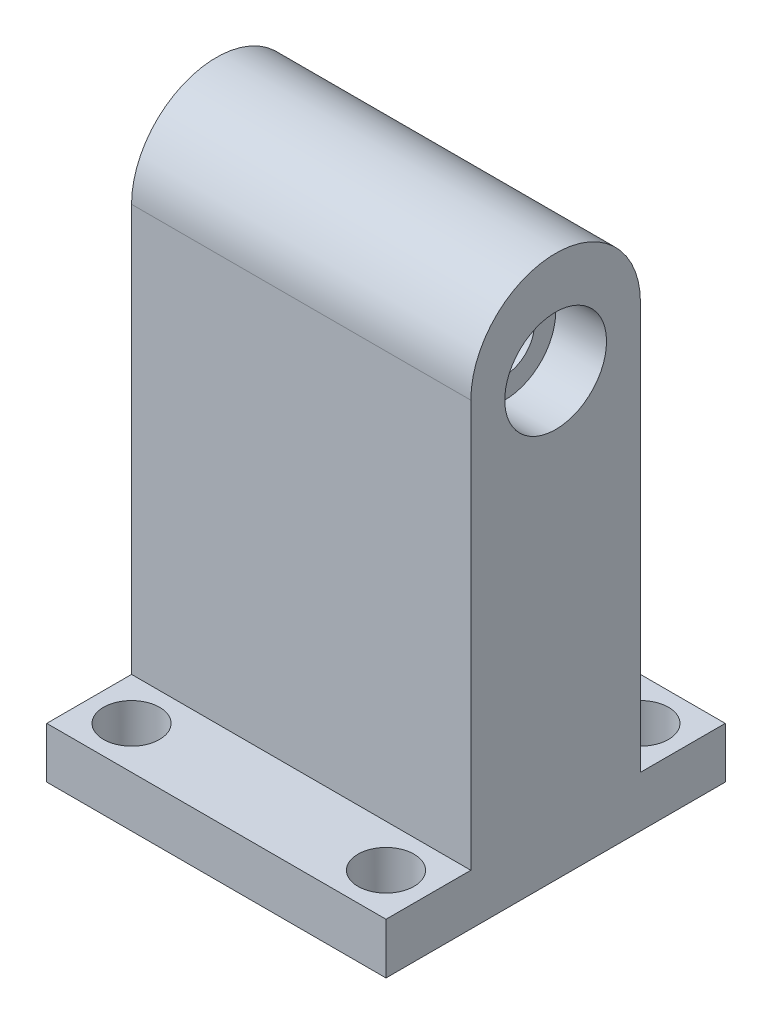
ISO-10303-21;
HEADER;
FILE_DESCRIPTION(('STEP AP214'),'2;1');
FILE_NAME('part.step','',(''),(''),'','','');
FILE_SCHEMA(('AUTOMOTIVE_DESIGN { 1 0 10303 214 1 1 1 1 }'));
ENDSEC;
DATA;
#1=APPLICATION_CONTEXT('core data for automotive mechanical design processes');
#2=APPLICATION_PROTOCOL_DEFINITION('international standard','automotive_design',2000,#1);
#3=PRODUCT_CONTEXT('',#1,'mechanical');
#4=PRODUCT('Part','Part','',(#3));
#5=PRODUCT_RELATED_PRODUCT_CATEGORY('part','',(#4));
#6=PRODUCT_DEFINITION_FORMATION('','',#4);
#7=PRODUCT_DEFINITION_CONTEXT('part definition',#1,'design');
#8=PRODUCT_DEFINITION('design','',#6,#7);
#9=PRODUCT_DEFINITION_SHAPE('','',#8);
#10=(LENGTH_UNIT() NAMED_UNIT(*) SI_UNIT(.MILLI.,.METRE.));
#11=(NAMED_UNIT(*) PLANE_ANGLE_UNIT() SI_UNIT($,.RADIAN.));
#12=(NAMED_UNIT(*) SI_UNIT($,.STERADIAN.) SOLID_ANGLE_UNIT());
#13=UNCERTAINTY_MEASURE_WITH_UNIT(LENGTH_MEASURE(1.E-05),#10,'distance_accuracy_value','');
#14=(GEOMETRIC_REPRESENTATION_CONTEXT(3) GLOBAL_UNCERTAINTY_ASSIGNED_CONTEXT((#13)) GLOBAL_UNIT_ASSIGNED_CONTEXT((#10,
#11,#12)) REPRESENTATION_CONTEXT('',''));
#15=CARTESIAN_POINT('',(0.,0.,0.));
#16=DIRECTION('',(0.,0.,1.));
#17=DIRECTION('',(1.,0.,0.));
#18=AXIS2_PLACEMENT_3D('',#15,#16,#17);
#19=CARTESIAN_POINT('',(-10.,26.,0.));
#20=DIRECTION('',(1.,0.,0.));
#21=DIRECTION('',(0.,0.,-1.));
#22=AXIS2_PLACEMENT_3D('',#19,#20,#21);
#23=CYLINDRICAL_SURFACE('',#22,1.75);
#24=CARTESIAN_POINT('',(7.,26.,0.));
#25=DIRECTION('',(1.,0.,0.));
#26=DIRECTION('',(0.,0.,-1.));
#27=AXIS2_PLACEMENT_3D('',#24,#25,#26);
#28=CIRCLE('',#27,1.75);
#29=CARTESIAN_POINT('',(7.,26.,-1.75));
#30=VERTEX_POINT('',#29);
#31=EDGE_CURVE('E167',#30,#30,#28,.T.);
#32=ORIENTED_EDGE('',*,*,#31,.T.);
#33=EDGE_LOOP('',(#32));
#34=FACE_BOUND('',#33,.T.);
#35=CARTESIAN_POINT('',(-7.,26.,0.));
#36=DIRECTION('',(-1.,0.,0.));
#37=DIRECTION('',(0.,0.,1.));
#38=AXIS2_PLACEMENT_3D('',#35,#36,#37);
#39=CIRCLE('',#38,1.75);
#40=CARTESIAN_POINT('',(-7.,26.,1.75));
#41=VERTEX_POINT('',#40);
#42=EDGE_CURVE('E164',#41,#41,#39,.F.);
#43=ORIENTED_EDGE('',*,*,#42,.F.);
#44=EDGE_LOOP('',(#43));
#45=FACE_BOUND('',#44,.T.);
#46=ADVANCED_FACE('F43',(#34,#45),#23,.F.);
#47=CARTESIAN_POINT('',(10.,36.,-9.99999999999999));
#48=DIRECTION('',(-1.,0.,0.));
#49=DIRECTION('',(0.,0.,1.));
#50=AXIS2_PLACEMENT_3D('',#47,#48,#49);
#51=PLANE('',#50);
#52=CARTESIAN_POINT('',(10.,26.,0.));
#53=DIRECTION('',(1.,0.,0.));
#54=DIRECTION('',(0.,0.,-1.));
#55=AXIS2_PLACEMENT_3D('',#52,#53,#54);
#56=CIRCLE('',#55,3.);
#57=CARTESIAN_POINT('',(10.,26.,-3.));
#58=VERTEX_POINT('',#57);
#59=EDGE_CURVE('E147',#58,#58,#56,.T.);
#60=ORIENTED_EDGE('',*,*,#59,.F.);
#61=EDGE_LOOP('',(#60));
#62=FACE_BOUND('',#61,.T.);
#63=DIRECTION('',(0.,-1.,0.));
#64=VECTOR('',#63,1.);
#65=CARTESIAN_POINT('',(10.,27.,5.));
#66=LINE('',#65,#64);
#67=CARTESIAN_POINT('',(10.,27.,5.));
#68=VERTEX_POINT('',#67);
#69=CARTESIAN_POINT('',(10.,3.,5.));
#70=VERTEX_POINT('',#69);
#71=EDGE_CURVE('E297',#68,#70,#66,.T.);
#72=ORIENTED_EDGE('',*,*,#71,.T.);
#73=DIRECTION('',(0.,0.,1.));
#74=VECTOR('',#73,1.);
#75=CARTESIAN_POINT('',(10.,3.,5.));
#76=LINE('',#75,#74);
#77=CARTESIAN_POINT('',(10.,3.,10.));
#78=VERTEX_POINT('',#77);
#79=EDGE_CURVE('E131',#70,#78,#76,.T.);
#80=ORIENTED_EDGE('',*,*,#79,.T.);
#81=DIRECTION('',(0.,-1.,0.));
#82=VECTOR('',#81,1.);
#83=CARTESIAN_POINT('',(10.,36.,10.));
#84=LINE('',#83,#82);
#85=CARTESIAN_POINT('',(10.,0.,10.));
#86=VERTEX_POINT('',#85);
#87=EDGE_CURVE('E69',#78,#86,#84,.T.);
#88=ORIENTED_EDGE('',*,*,#87,.T.);
#89=DIRECTION('',(0.,0.,-1.));
#90=VECTOR('',#89,1.);
#91=CARTESIAN_POINT('',(10.,0.,-9.99999999999999));
#92=LINE('',#91,#90);
#93=CARTESIAN_POINT('',(10.,0.,-9.99999999999999));
#94=VERTEX_POINT('',#93);
#95=EDGE_CURVE('E135',#86,#94,#92,.T.);
#96=ORIENTED_EDGE('',*,*,#95,.T.);
#97=DIRECTION('',(0.,-1.,0.));
#98=VECTOR('',#97,1.);
#99=CARTESIAN_POINT('',(10.,36.,-9.99999999999999));
#100=LINE('',#99,#98);
#101=CARTESIAN_POINT('',(10.,3.,-10.));
#102=VERTEX_POINT('',#101);
#103=EDGE_CURVE('E11',#102,#94,#100,.T.);
#104=ORIENTED_EDGE('',*,*,#103,.F.);
#105=DIRECTION('',(0.,0.,1.));
#106=VECTOR('',#105,1.);
#107=CARTESIAN_POINT('',(10.,3.,-10.));
#108=LINE('',#107,#106);
#109=CARTESIAN_POINT('',(10.,3.,-5.));
#110=VERTEX_POINT('',#109);
#111=EDGE_CURVE('E111',#102,#110,#108,.T.);
#112=ORIENTED_EDGE('',*,*,#111,.T.);
#113=DIRECTION('',(0.,1.,0.));
#114=VECTOR('',#113,1.);
#115=CARTESIAN_POINT('',(10.,3.,-5.));
#116=LINE('',#115,#114);
#117=CARTESIAN_POINT('',(10.,27.,-5.));
#118=VERTEX_POINT('',#117);
#119=EDGE_CURVE('E123',#110,#118,#116,.T.);
#120=ORIENTED_EDGE('',*,*,#119,.T.);
#121=CARTESIAN_POINT('',(10.,27.,0.));
#122=DIRECTION('',(1.,0.,0.));
#123=DIRECTION('',(0.,0.,-1.));
#124=AXIS2_PLACEMENT_3D('',#121,#122,#123);
#125=CIRCLE('',#124,5.);
#126=EDGE_CURVE('E293',#118,#68,#125,.T.);
#127=ORIENTED_EDGE('',*,*,#126,.T.);
#128=EDGE_LOOP('',(#72,#80,#88,#96,#104,#112,#120,#127));
#129=FACE_BOUND('',#128,.T.);
#130=ADVANCED_FACE('F45',(#62,#129),#51,.F.);
#131=CARTESIAN_POINT('',(-10.,36.,-9.99999999999999));
#132=DIRECTION('',(0.,0.,1.));
#133=DIRECTION('',(1.,0.,0.));
#134=AXIS2_PLACEMENT_3D('',#131,#132,#133);
#135=PLANE('',#134);
#136=DIRECTION('',(0.,-1.,0.));
#137=VECTOR('',#136,1.);
#138=CARTESIAN_POINT('',(-10.,36.,-9.99999999999999));
#139=LINE('',#138,#137);
#140=CARTESIAN_POINT('',(-10.,3.,-9.99999999999999));
#141=VERTEX_POINT('',#140);
#142=CARTESIAN_POINT('',(-10.,0.,-9.99999999999999));
#143=VERTEX_POINT('',#142);
#144=EDGE_CURVE('E53',#141,#143,#139,.T.);
#145=ORIENTED_EDGE('',*,*,#144,.F.);
#146=DIRECTION('',(-1.,0.,0.));
#147=VECTOR('',#146,1.);
#148=CARTESIAN_POINT('',(10.,3.,-10.));
#149=LINE('',#148,#147);
#150=EDGE_CURVE('E116',#102,#141,#149,.T.);
#151=ORIENTED_EDGE('',*,*,#150,.F.);
#152=ORIENTED_EDGE('',*,*,#103,.T.);
#153=DIRECTION('',(-1.,0.,0.));
#154=VECTOR('',#153,1.);
#155=CARTESIAN_POINT('',(-10.,0.,-9.99999999999999));
#156=LINE('',#155,#154);
#157=EDGE_CURVE('E139',#94,#143,#156,.T.);
#158=ORIENTED_EDGE('',*,*,#157,.T.);
#159=EDGE_LOOP('',(#145,#151,#152,#158));
#160=FACE_BOUND('',#159,.T.);
#161=ADVANCED_FACE('F127',(#160),#135,.F.);
#162=CARTESIAN_POINT('',(-10.,36.,-9.99999999999999));
#163=DIRECTION('',(1.,0.,0.));
#164=DIRECTION('',(0.,0.,-1.));
#165=AXIS2_PLACEMENT_3D('',#162,#163,#164);
#166=PLANE('',#165);
#167=CARTESIAN_POINT('',(-10.,26.,0.));
#168=DIRECTION('',(-1.,0.,0.));
#169=DIRECTION('',(0.,0.,1.));
#170=AXIS2_PLACEMENT_3D('',#167,#168,#169);
#171=CIRCLE('',#170,3.);
#172=CARTESIAN_POINT('',(-10.,26.,3.));
#173=VERTEX_POINT('',#172);
#174=EDGE_CURVE('E217',#173,#173,#171,.T.);
#175=ORIENTED_EDGE('',*,*,#174,.F.);
#176=EDGE_LOOP('',(#175));
#177=FACE_BOUND('',#176,.T.);
#178=DIRECTION('',(0.,-1.,0.));
#179=VECTOR('',#178,1.);
#180=CARTESIAN_POINT('',(-10.,36.,10.));
#181=LINE('',#180,#179);
#182=CARTESIAN_POINT('',(-10.,3.,10.));
#183=VERTEX_POINT('',#182);
#184=CARTESIAN_POINT('',(-10.,0.,10.));
#185=VERTEX_POINT('',#184);
#186=EDGE_CURVE('E159',#183,#185,#181,.T.);
#187=ORIENTED_EDGE('',*,*,#186,.F.);
#188=DIRECTION('',(0.,0.,1.));
#189=VECTOR('',#188,1.);
#190=CARTESIAN_POINT('',(-10.,3.,5.));
#191=LINE('',#190,#189);
#192=CARTESIAN_POINT('',(-10.,3.,5.));
#193=VERTEX_POINT('',#192);
#194=EDGE_CURVE('E61',#193,#183,#191,.T.);
#195=ORIENTED_EDGE('',*,*,#194,.F.);
#196=DIRECTION('',(0.,-1.,0.));
#197=VECTOR('',#196,1.);
#198=CARTESIAN_POINT('',(-10.,27.,5.));
#199=LINE('',#198,#197);
#200=CARTESIAN_POINT('',(-10.,27.,5.));
#201=VERTEX_POINT('',#200);
#202=EDGE_CURVE('E286',#201,#193,#199,.T.);
#203=ORIENTED_EDGE('',*,*,#202,.F.);
#204=CARTESIAN_POINT('',(-10.,27.,0.));
#205=DIRECTION('',(1.,0.,0.));
#206=DIRECTION('',(0.,0.,-1.));
#207=AXIS2_PLACEMENT_3D('',#204,#205,#206);
#208=CIRCLE('',#207,5.);
#209=CARTESIAN_POINT('',(-10.,27.,-5.));
#210=VERTEX_POINT('',#209);
#211=EDGE_CURVE('E279',#210,#201,#208,.T.);
#212=ORIENTED_EDGE('',*,*,#211,.F.);
#213=DIRECTION('',(0.,1.,0.));
#214=VECTOR('',#213,1.);
#215=CARTESIAN_POINT('',(-10.,3.,-5.));
#216=LINE('',#215,#214);
#217=CARTESIAN_POINT('',(-10.,3.,-5.));
#218=VERTEX_POINT('',#217);
#219=EDGE_CURVE('E275',#218,#210,#216,.T.);
#220=ORIENTED_EDGE('',*,*,#219,.F.);
#221=DIRECTION('',(0.,0.,1.));
#222=VECTOR('',#221,1.);
#223=CARTESIAN_POINT('',(-10.,3.,-9.99999999999999));
#224=LINE('',#223,#222);
#225=EDGE_CURVE('E272',#141,#218,#224,.T.);
#226=ORIENTED_EDGE('',*,*,#225,.F.);
#227=ORIENTED_EDGE('',*,*,#144,.T.);
#228=DIRECTION('',(0.,0.,1.));
#229=VECTOR('',#228,1.);
#230=CARTESIAN_POINT('',(-10.,0.,-9.99999999999999));
#231=LINE('',#230,#229);
#232=EDGE_CURVE('E144',#143,#185,#231,.T.);
#233=ORIENTED_EDGE('',*,*,#232,.T.);
#234=EDGE_LOOP('',(#187,#195,#203,#212,#220,#226,#227,#233));
#235=FACE_BOUND('',#234,.T.);
#236=ADVANCED_FACE('F239',(#177,#235),#166,.F.);
#237=CARTESIAN_POINT('',(-10.,36.,10.));
#238=DIRECTION('',(0.,0.,-1.));
#239=DIRECTION('',(-1.,0.,0.));
#240=AXIS2_PLACEMENT_3D('',#237,#238,#239);
#241=PLANE('',#240);
#242=ORIENTED_EDGE('',*,*,#87,.F.);
#243=DIRECTION('',(-1.,0.,0.));
#244=VECTOR('',#243,1.);
#245=CARTESIAN_POINT('',(10.,3.,10.));
#246=LINE('',#245,#244);
#247=EDGE_CURVE('E173',#78,#183,#246,.T.);
#248=ORIENTED_EDGE('',*,*,#247,.T.);
#249=ORIENTED_EDGE('',*,*,#186,.T.);
#250=DIRECTION('',(1.,0.,0.));
#251=VECTOR('',#250,1.);
#252=CARTESIAN_POINT('',(-10.,0.,10.));
#253=LINE('',#252,#251);
#254=EDGE_CURVE('E154',#185,#86,#253,.T.);
#255=ORIENTED_EDGE('',*,*,#254,.T.);
#256=EDGE_LOOP('',(#242,#248,#249,#255));
#257=FACE_BOUND('',#256,.T.);
#258=ADVANCED_FACE('F259',(#257),#241,.F.);
#259=CARTESIAN_POINT('',(0.,0.,0.));
#260=DIRECTION('',(0.,1.,0.));
#261=DIRECTION('',(0.,0.,1.));
#262=AXIS2_PLACEMENT_3D('',#259,#260,#261);
#263=PLANE('',#262);
#264=CARTESIAN_POINT('',(-7.5,0.,7.50000000000001));
#265=DIRECTION('',(0.,1.,0.));
#266=DIRECTION('',(0.,0.,1.));
#267=AXIS2_PLACEMENT_3D('',#264,#265,#266);
#268=CIRCLE('',#267,1.64955961301493);
#269=CARTESIAN_POINT('',(-7.5,0.,9.14955961301494));
#270=VERTEX_POINT('',#269);
#271=EDGE_CURVE('E201',#270,#270,#268,.T.);
#272=ORIENTED_EDGE('',*,*,#271,.T.);
#273=EDGE_LOOP('',(#272));
#274=FACE_BOUND('',#273,.T.);
#275=CARTESIAN_POINT('',(7.5,0.,7.50000000000001));
#276=DIRECTION('',(0.,1.,0.));
#277=DIRECTION('',(0.,0.,1.));
#278=AXIS2_PLACEMENT_3D('',#275,#276,#277);
#279=CIRCLE('',#278,1.64955961301494);
#280=CARTESIAN_POINT('',(7.5,0.,9.14955961301494));
#281=VERTEX_POINT('',#280);
#282=EDGE_CURVE('E207',#281,#281,#279,.T.);
#283=ORIENTED_EDGE('',*,*,#282,.T.);
#284=EDGE_LOOP('',(#283));
#285=FACE_BOUND('',#284,.T.);
#286=CARTESIAN_POINT('',(7.5,0.,-7.49999999999999));
#287=DIRECTION('',(0.,1.,0.));
#288=DIRECTION('',(0.,0.,1.));
#289=AXIS2_PLACEMENT_3D('',#286,#287,#288);
#290=CIRCLE('',#289,1.64955961301494);
#291=CARTESIAN_POINT('',(7.5,0.,-5.85044038698506));
#292=VERTEX_POINT('',#291);
#293=EDGE_CURVE('E202',#292,#292,#290,.T.);
#294=ORIENTED_EDGE('',*,*,#293,.T.);
#295=EDGE_LOOP('',(#294));
#296=FACE_BOUND('',#295,.T.);
#297=CARTESIAN_POINT('',(-7.5,0.,-7.49999999999999));
#298=DIRECTION('',(0.,1.,0.));
#299=DIRECTION('',(0.,0.,1.));
#300=AXIS2_PLACEMENT_3D('',#297,#298,#299);
#301=CIRCLE('',#300,1.64955961301493);
#302=CARTESIAN_POINT('',(-7.5,0.,-5.85044038698506));
#303=VERTEX_POINT('',#302);
#304=EDGE_CURVE('E206',#303,#303,#301,.T.);
#305=ORIENTED_EDGE('',*,*,#304,.T.);
#306=EDGE_LOOP('',(#305));
#307=FACE_BOUND('',#306,.T.);
#308=ORIENTED_EDGE('',*,*,#95,.F.);
#309=ORIENTED_EDGE('',*,*,#254,.F.);
#310=ORIENTED_EDGE('',*,*,#232,.F.);
#311=ORIENTED_EDGE('',*,*,#157,.F.);
#312=EDGE_LOOP('',(#308,#309,#310,#311));
#313=FACE_BOUND('',#312,.T.);
#314=ADVANCED_FACE('F255',(#274,#285,#296,#307,#313),#263,.F.);
#315=CARTESIAN_POINT('',(7.,26.,0.));
#316=DIRECTION('',(1.,0.,0.));
#317=DIRECTION('',(0.,0.,-1.));
#318=AXIS2_PLACEMENT_3D('',#315,#316,#317);
#319=CYLINDRICAL_SURFACE('',#318,3.);
#320=CARTESIAN_POINT('',(7.,26.,0.));
#321=DIRECTION('',(1.,0.,0.));
#322=DIRECTION('',(0.,0.,-1.));
#323=AXIS2_PLACEMENT_3D('',#320,#321,#322);
#324=CIRCLE('',#323,3.);
#325=CARTESIAN_POINT('',(7.,26.,-3.));
#326=VERTEX_POINT('',#325);
#327=EDGE_CURVE('E140',#326,#326,#324,.T.);
#328=ORIENTED_EDGE('',*,*,#327,.F.);
#329=EDGE_LOOP('',(#328));
#330=FACE_BOUND('',#329,.T.);
#331=ORIENTED_EDGE('',*,*,#59,.T.);
#332=EDGE_LOOP('',(#331));
#333=FACE_BOUND('',#332,.T.);
#334=ADVANCED_FACE('F232',(#330,#333),#319,.F.);
#335=CARTESIAN_POINT('',(7.,26.,0.));
#336=DIRECTION('',(1.,0.,0.));
#337=DIRECTION('',(0.,0.,-1.));
#338=AXIS2_PLACEMENT_3D('',#335,#336,#337);
#339=PLANE('',#338);
#340=ORIENTED_EDGE('',*,*,#31,.F.);
#341=EDGE_LOOP('',(#340));
#342=FACE_BOUND('',#341,.T.);
#343=ORIENTED_EDGE('',*,*,#327,.T.);
#344=EDGE_LOOP('',(#343));
#345=FACE_BOUND('',#344,.T.);
#346=ADVANCED_FACE('F248',(#342,#345),#339,.T.);
#347=CARTESIAN_POINT('',(-7.,26.,0.));
#348=DIRECTION('',(-1.,0.,0.));
#349=DIRECTION('',(0.,0.,1.));
#350=AXIS2_PLACEMENT_3D('',#347,#348,#349);
#351=PLANE('',#350);
#352=CARTESIAN_POINT('',(-7.,26.,0.));
#353=DIRECTION('',(-1.,0.,0.));
#354=DIRECTION('',(0.,0.,1.));
#355=AXIS2_PLACEMENT_3D('',#352,#353,#354);
#356=CIRCLE('',#355,3.);
#357=CARTESIAN_POINT('',(-7.,26.,3.));
#358=VERTEX_POINT('',#357);
#359=EDGE_CURVE('E168',#358,#358,#356,.T.);
#360=ORIENTED_EDGE('',*,*,#359,.T.);
#361=EDGE_LOOP('',(#360));
#362=FACE_BOUND('',#361,.T.);
#363=ORIENTED_EDGE('',*,*,#42,.T.);
#364=EDGE_LOOP('',(#363));
#365=FACE_BOUND('',#364,.T.);
#366=ADVANCED_FACE('F251',(#362,#365),#351,.T.);
#367=CARTESIAN_POINT('',(-7.,26.,0.));
#368=DIRECTION('',(-1.,0.,0.));
#369=DIRECTION('',(0.,0.,1.));
#370=AXIS2_PLACEMENT_3D('',#367,#368,#369);
#371=CYLINDRICAL_SURFACE('',#370,3.);
#372=ORIENTED_EDGE('',*,*,#359,.F.);
#373=EDGE_LOOP('',(#372));
#374=FACE_BOUND('',#373,.T.);
#375=ORIENTED_EDGE('',*,*,#174,.T.);
#376=EDGE_LOOP('',(#375));
#377=FACE_BOUND('',#376,.T.);
#378=ADVANCED_FACE('F246',(#374,#377),#371,.F.);
#379=CARTESIAN_POINT('',(-7.5,0.,-7.49999999999999));
#380=DIRECTION('',(0.,1.,0.));
#381=DIRECTION('',(0.,0.,1.));
#382=AXIS2_PLACEMENT_3D('',#379,#380,#381);
#383=CYLINDRICAL_SURFACE('',#382,1.64955961301493);
#384=CARTESIAN_POINT('',(-7.5,3.,-7.49999999999999));
#385=DIRECTION('',(0.,-1.,0.));
#386=DIRECTION('',(0.,0.,-1.));
#387=AXIS2_PLACEMENT_3D('',#384,#385,#386);
#388=CIRCLE('',#387,1.64955961301493);
#389=CARTESIAN_POINT('',(-7.5,3.,-9.14955961301493));
#390=VERTEX_POINT('',#389);
#391=EDGE_CURVE('E197',#390,#390,#388,.F.);
#392=ORIENTED_EDGE('',*,*,#391,.T.);
#393=EDGE_LOOP('',(#392));
#394=FACE_BOUND('',#393,.T.);
#395=ORIENTED_EDGE('',*,*,#304,.F.);
#396=EDGE_LOOP('',(#395));
#397=FACE_BOUND('',#396,.T.);
#398=ADVANCED_FACE('F326',(#394,#397),#383,.F.);
#399=CARTESIAN_POINT('',(7.5,0.,-7.49999999999999));
#400=DIRECTION('',(0.,1.,0.));
#401=DIRECTION('',(0.,0.,1.));
#402=AXIS2_PLACEMENT_3D('',#399,#400,#401);
#403=CYLINDRICAL_SURFACE('',#402,1.64955961301494);
#404=CARTESIAN_POINT('',(7.5,3.,-7.49999999999999));
#405=DIRECTION('',(0.,-1.,0.));
#406=DIRECTION('',(0.,0.,-1.));
#407=AXIS2_PLACEMENT_3D('',#404,#405,#406);
#408=CIRCLE('',#407,1.64955961301494);
#409=CARTESIAN_POINT('',(7.5,3.,-9.14955961301493));
#410=VERTEX_POINT('',#409);
#411=EDGE_CURVE('E47',#410,#410,#408,.F.);
#412=ORIENTED_EDGE('',*,*,#411,.T.);
#413=EDGE_LOOP('',(#412));
#414=FACE_BOUND('',#413,.T.);
#415=ORIENTED_EDGE('',*,*,#293,.F.);
#416=EDGE_LOOP('',(#415));
#417=FACE_BOUND('',#416,.T.);
#418=ADVANCED_FACE('F322',(#414,#417),#403,.F.);
#419=CARTESIAN_POINT('',(7.5,0.,7.50000000000001));
#420=DIRECTION('',(0.,1.,0.));
#421=DIRECTION('',(0.,0.,1.));
#422=AXIS2_PLACEMENT_3D('',#419,#420,#421);
#423=CYLINDRICAL_SURFACE('',#422,1.64955961301494);
#424=CARTESIAN_POINT('',(7.5,3.,7.50000000000001));
#425=DIRECTION('',(0.,-1.,0.));
#426=DIRECTION('',(0.,0.,-1.));
#427=AXIS2_PLACEMENT_3D('',#424,#425,#426);
#428=CIRCLE('',#427,1.64955961301494);
#429=CARTESIAN_POINT('',(7.5,3.,5.85044038698507));
#430=VERTEX_POINT('',#429);
#431=EDGE_CURVE('E172',#430,#430,#428,.F.);
#432=ORIENTED_EDGE('',*,*,#431,.T.);
#433=EDGE_LOOP('',(#432));
#434=FACE_BOUND('',#433,.T.);
#435=ORIENTED_EDGE('',*,*,#282,.F.);
#436=EDGE_LOOP('',(#435));
#437=FACE_BOUND('',#436,.T.);
#438=ADVANCED_FACE('F325',(#434,#437),#423,.F.);
#439=CARTESIAN_POINT('',(-7.5,0.,7.50000000000001));
#440=DIRECTION('',(0.,1.,0.));
#441=DIRECTION('',(0.,0.,1.));
#442=AXIS2_PLACEMENT_3D('',#439,#440,#441);
#443=CYLINDRICAL_SURFACE('',#442,1.64955961301493);
#444=CARTESIAN_POINT('',(-7.5,3.,7.50000000000001));
#445=DIRECTION('',(0.,-1.,0.));
#446=DIRECTION('',(0.,0.,-1.));
#447=AXIS2_PLACEMENT_3D('',#444,#445,#446);
#448=CIRCLE('',#447,1.64955961301493);
#449=CARTESIAN_POINT('',(-7.5,3.,5.85044038698507));
#450=VERTEX_POINT('',#449);
#451=EDGE_CURVE('E169',#450,#450,#448,.F.);
#452=ORIENTED_EDGE('',*,*,#451,.T.);
#453=EDGE_LOOP('',(#452));
#454=FACE_BOUND('',#453,.T.);
#455=ORIENTED_EDGE('',*,*,#271,.F.);
#456=EDGE_LOOP('',(#455));
#457=FACE_BOUND('',#456,.T.);
#458=ADVANCED_FACE('F320',(#454,#457),#443,.F.);
#459=CARTESIAN_POINT('',(10.,3.,-10.));
#460=DIRECTION('',(0.,-1.,0.));
#461=DIRECTION('',(0.,0.,-1.));
#462=AXIS2_PLACEMENT_3D('',#459,#460,#461);
#463=PLANE('',#462);
#464=ORIENTED_EDGE('',*,*,#411,.F.);
#465=EDGE_LOOP('',(#464));
#466=FACE_BOUND('',#465,.T.);
#467=ORIENTED_EDGE('',*,*,#225,.T.);
#468=DIRECTION('',(-1.,0.,0.));
#469=VECTOR('',#468,1.);
#470=CARTESIAN_POINT('',(10.,3.,-5.));
#471=LINE('',#470,#469);
#472=EDGE_CURVE('E118',#110,#218,#471,.T.);
#473=ORIENTED_EDGE('',*,*,#472,.F.);
#474=ORIENTED_EDGE('',*,*,#111,.F.);
#475=ORIENTED_EDGE('',*,*,#150,.T.);
#476=EDGE_LOOP('',(#467,#473,#474,#475));
#477=FACE_BOUND('',#476,.T.);
#478=ORIENTED_EDGE('',*,*,#391,.F.);
#479=EDGE_LOOP('',(#478));
#480=FACE_BOUND('',#479,.T.);
#481=ADVANCED_FACE('F114',(#466,#477,#480),#463,.F.);
#482=CARTESIAN_POINT('',(10.,3.,5.));
#483=DIRECTION('',(0.,-1.,0.));
#484=DIRECTION('',(0.,0.,-1.));
#485=AXIS2_PLACEMENT_3D('',#482,#483,#484);
#486=PLANE('',#485);
#487=ORIENTED_EDGE('',*,*,#451,.F.);
#488=EDGE_LOOP('',(#487));
#489=FACE_BOUND('',#488,.T.);
#490=ORIENTED_EDGE('',*,*,#194,.T.);
#491=ORIENTED_EDGE('',*,*,#247,.F.);
#492=ORIENTED_EDGE('',*,*,#79,.F.);
#493=DIRECTION('',(-1.,0.,0.));
#494=VECTOR('',#493,1.);
#495=CARTESIAN_POINT('',(10.,3.,5.));
#496=LINE('',#495,#494);
#497=EDGE_CURVE('E180',#70,#193,#496,.T.);
#498=ORIENTED_EDGE('',*,*,#497,.T.);
#499=EDGE_LOOP('',(#490,#491,#492,#498));
#500=FACE_BOUND('',#499,.T.);
#501=ORIENTED_EDGE('',*,*,#431,.F.);
#502=EDGE_LOOP('',(#501));
#503=FACE_BOUND('',#502,.T.);
#504=ADVANCED_FACE('F302',(#489,#500,#503),#486,.F.);
#505=CARTESIAN_POINT('',(10.,27.,5.));
#506=DIRECTION('',(0.,0.,-1.));
#507=DIRECTION('',(0.,1.,0.));
#508=AXIS2_PLACEMENT_3D('',#505,#506,#507);
#509=PLANE('',#508);
#510=ORIENTED_EDGE('',*,*,#202,.T.);
#511=ORIENTED_EDGE('',*,*,#497,.F.);
#512=ORIENTED_EDGE('',*,*,#71,.F.);
#513=DIRECTION('',(-1.,0.,0.));
#514=VECTOR('',#513,1.);
#515=CARTESIAN_POINT('',(10.,27.,5.));
#516=LINE('',#515,#514);
#517=EDGE_CURVE('E185',#68,#201,#516,.T.);
#518=ORIENTED_EDGE('',*,*,#517,.T.);
#519=EDGE_LOOP('',(#510,#511,#512,#518));
#520=FACE_BOUND('',#519,.T.);
#521=ADVANCED_FACE('F304',(#520),#509,.F.);
#522=CARTESIAN_POINT('',(10.,27.,0.));
#523=DIRECTION('',(-1.,0.,0.));
#524=DIRECTION('',(0.,0.,1.));
#525=AXIS2_PLACEMENT_3D('',#522,#523,#524);
#526=CYLINDRICAL_SURFACE('',#525,5.);
#527=ORIENTED_EDGE('',*,*,#211,.T.);
#528=ORIENTED_EDGE('',*,*,#517,.F.);
#529=ORIENTED_EDGE('',*,*,#126,.F.);
#530=DIRECTION('',(-1.,0.,0.));
#531=VECTOR('',#530,1.);
#532=CARTESIAN_POINT('',(10.,27.,-5.));
#533=LINE('',#532,#531);
#534=EDGE_CURVE('E192',#118,#210,#533,.T.);
#535=ORIENTED_EDGE('',*,*,#534,.T.);
#536=EDGE_LOOP('',(#527,#528,#529,#535));
#537=FACE_BOUND('',#536,.T.);
#538=ADVANCED_FACE('F307',(#537),#526,.T.);
#539=CARTESIAN_POINT('',(10.,3.,-5.));
#540=DIRECTION('',(0.,0.,1.));
#541=DIRECTION('',(0.,-1.,0.));
#542=AXIS2_PLACEMENT_3D('',#539,#540,#541);
#543=PLANE('',#542);
#544=ORIENTED_EDGE('',*,*,#219,.T.);
#545=ORIENTED_EDGE('',*,*,#534,.F.);
#546=ORIENTED_EDGE('',*,*,#119,.F.);
#547=ORIENTED_EDGE('',*,*,#472,.T.);
#548=EDGE_LOOP('',(#544,#545,#546,#547));
#549=FACE_BOUND('',#548,.T.);
#550=ADVANCED_FACE('F309',(#549),#543,.F.);
#551=CLOSED_SHELL('',(#46,#130,#161,#236,#258,#314,#334,#346,#366,#378,#398,#418,#438,#458,#481,
#504,#521,#538,#550));
#552=MANIFOLD_SOLID_BREP('B2',#551);
#553=ADVANCED_BREP_SHAPE_REPRESENTATION('',(#18,#552),#14);
#554=SHAPE_DEFINITION_REPRESENTATION(#9,#553);
ENDSEC;
END-ISO-10303-21;
